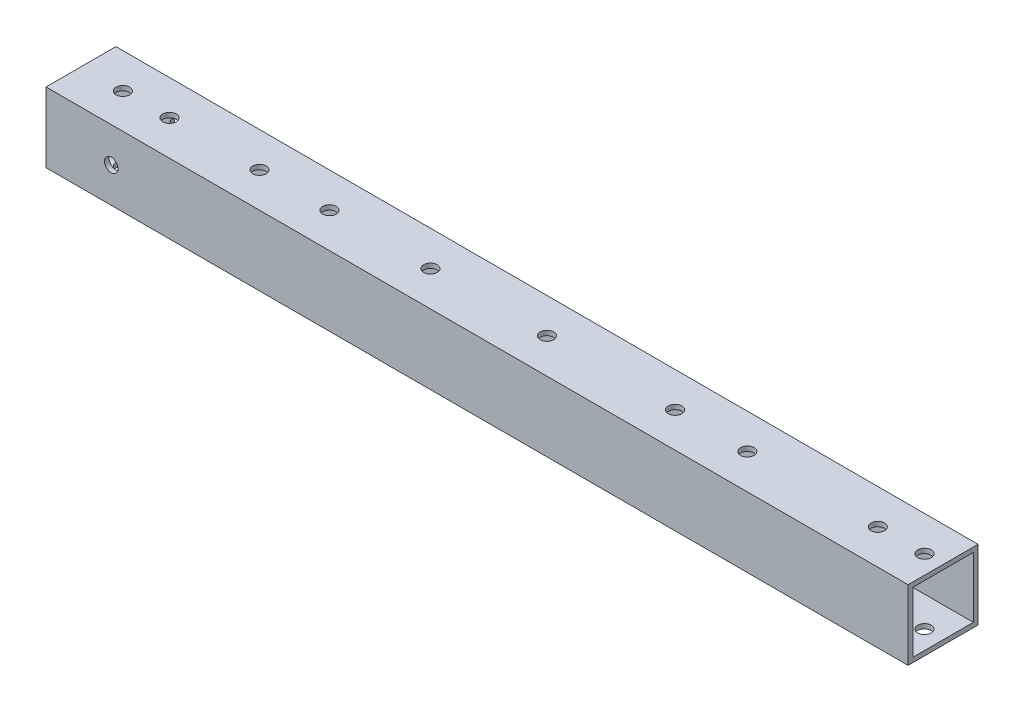
ISO-10303-21;
HEADER;
FILE_DESCRIPTION(('STEP AP214'),'2;1');
FILE_NAME('part.step','',(''),(''),'','','');
FILE_SCHEMA(('AUTOMOTIVE_DESIGN { 1 0 10303 214 1 1 1 1 }'));
ENDSEC;
DATA;
#1=APPLICATION_CONTEXT('core data for automotive mechanical design processes');
#2=APPLICATION_PROTOCOL_DEFINITION('international standard','automotive_design',2000,#1);
#3=PRODUCT_CONTEXT('',#1,'mechanical');
#4=PRODUCT('Part','Part','',(#3));
#5=PRODUCT_RELATED_PRODUCT_CATEGORY('part','',(#4));
#6=PRODUCT_DEFINITION_FORMATION('','',#4);
#7=PRODUCT_DEFINITION_CONTEXT('part definition',#1,'design');
#8=PRODUCT_DEFINITION('design','',#6,#7);
#9=PRODUCT_DEFINITION_SHAPE('','',#8);
#10=(LENGTH_UNIT() NAMED_UNIT(*) SI_UNIT(.MILLI.,.METRE.));
#11=(NAMED_UNIT(*) PLANE_ANGLE_UNIT() SI_UNIT($,.RADIAN.));
#12=(NAMED_UNIT(*) SI_UNIT($,.STERADIAN.) SOLID_ANGLE_UNIT());
#13=UNCERTAINTY_MEASURE_WITH_UNIT(LENGTH_MEASURE(1.E-05),#10,'distance_accuracy_value','');
#14=(GEOMETRIC_REPRESENTATION_CONTEXT(3) GLOBAL_UNCERTAINTY_ASSIGNED_CONTEXT((#13)) GLOBAL_UNIT_ASSIGNED_CONTEXT((#10,
#11,#12)) REPRESENTATION_CONTEXT('',''));
#15=CARTESIAN_POINT('',(0.,0.,0.));
#16=DIRECTION('',(0.,0.,1.));
#17=DIRECTION('',(1.,0.,0.));
#18=AXIS2_PLACEMENT_3D('',#15,#16,#17);
#19=CARTESIAN_POINT('',(185.,0.,0.));
#20=DIRECTION('',(-1.,0.,0.));
#21=DIRECTION('',(0.,0.,1.));
#22=AXIS2_PLACEMENT_3D('',#19,#20,#21);
#23=PLANE('',#22);
#24=DIRECTION('',(0.,1.,0.));
#25=VECTOR('',#24,1.);
#26=CARTESIAN_POINT('',(185.,-7.5,-7.5));
#27=LINE('',#26,#25);
#28=CARTESIAN_POINT('',(185.,-7.5,-7.5));
#29=VERTEX_POINT('',#28);
#30=CARTESIAN_POINT('',(185.,7.5,-7.5));
#31=VERTEX_POINT('',#30);
#32=EDGE_CURVE('E146',#29,#31,#27,.T.);
#33=ORIENTED_EDGE('',*,*,#32,.T.);
#34=DIRECTION('',(0.,0.,1.));
#35=VECTOR('',#34,1.);
#36=CARTESIAN_POINT('',(185.,7.5,7.5));
#37=LINE('',#36,#35);
#38=CARTESIAN_POINT('',(185.,7.5,7.5));
#39=VERTEX_POINT('',#38);
#40=EDGE_CURVE('E149',#31,#39,#37,.T.);
#41=ORIENTED_EDGE('',*,*,#40,.T.);
#42=DIRECTION('',(0.,-1.,0.));
#43=VECTOR('',#42,1.);
#44=CARTESIAN_POINT('',(185.,-7.5,7.5));
#45=LINE('',#44,#43);
#46=CARTESIAN_POINT('',(185.,-7.5,7.5));
#47=VERTEX_POINT('',#46);
#48=EDGE_CURVE('E152',#39,#47,#45,.T.);
#49=ORIENTED_EDGE('',*,*,#48,.T.);
#50=DIRECTION('',(0.,0.,-1.));
#51=VECTOR('',#50,1.);
#52=CARTESIAN_POINT('',(185.,-7.5,7.5));
#53=LINE('',#52,#51);
#54=EDGE_CURVE('E154',#47,#29,#53,.T.);
#55=ORIENTED_EDGE('',*,*,#54,.T.);
#56=EDGE_LOOP('',(#33,#41,#49,#55));
#57=FACE_BOUND('',#56,.T.);
#58=DIRECTION('',(0.,0.,-1.));
#59=VECTOR('',#58,1.);
#60=CARTESIAN_POINT('',(185.,-6.5,6.5));
#61=LINE('',#60,#59);
#62=CARTESIAN_POINT('',(185.,-6.5,6.5));
#63=VERTEX_POINT('',#62);
#64=CARTESIAN_POINT('',(185.,-6.5,-6.5));
#65=VERTEX_POINT('',#64);
#66=EDGE_CURVE('E108',#63,#65,#61,.T.);
#67=ORIENTED_EDGE('',*,*,#66,.F.);
#68=DIRECTION('',(0.,-1.,0.));
#69=VECTOR('',#68,1.);
#70=CARTESIAN_POINT('',(185.,-6.5,6.5));
#71=LINE('',#70,#69);
#72=CARTESIAN_POINT('',(185.,6.5,6.5));
#73=VERTEX_POINT('',#72);
#74=EDGE_CURVE('E130',#73,#63,#71,.T.);
#75=ORIENTED_EDGE('',*,*,#74,.F.);
#76=DIRECTION('',(0.,0.,1.));
#77=VECTOR('',#76,1.);
#78=CARTESIAN_POINT('',(185.,6.5,6.5));
#79=LINE('',#78,#77);
#80=CARTESIAN_POINT('',(185.,6.5,-6.5));
#81=VERTEX_POINT('',#80);
#82=EDGE_CURVE('E128',#81,#73,#79,.T.);
#83=ORIENTED_EDGE('',*,*,#82,.F.);
#84=DIRECTION('',(0.,1.,0.));
#85=VECTOR('',#84,1.);
#86=CARTESIAN_POINT('',(185.,-6.5,-6.5));
#87=LINE('',#86,#85);
#88=EDGE_CURVE('E116',#65,#81,#87,.T.);
#89=ORIENTED_EDGE('',*,*,#88,.F.);
#90=EDGE_LOOP('',(#67,#75,#83,#89));
#91=FACE_BOUND('',#90,.T.);
#92=ADVANCED_FACE('F41',(#57,#91),#23,.F.);
#93=CARTESIAN_POINT('',(0.,0.,0.));
#94=DIRECTION('',(-1.,0.,0.));
#95=DIRECTION('',(0.,0.,1.));
#96=AXIS2_PLACEMENT_3D('',#93,#94,#95);
#97=PLANE('',#96);
#98=DIRECTION('',(0.,1.,0.));
#99=VECTOR('',#98,1.);
#100=CARTESIAN_POINT('',(0.,-7.5,-7.5));
#101=LINE('',#100,#99);
#102=CARTESIAN_POINT('',(0.,-7.5,-7.5));
#103=VERTEX_POINT('',#102);
#104=CARTESIAN_POINT('',(0.,7.5,-7.5));
#105=VERTEX_POINT('',#104);
#106=EDGE_CURVE('E124',#103,#105,#101,.T.);
#107=ORIENTED_EDGE('',*,*,#106,.F.);
#108=DIRECTION('',(0.,0.,-1.));
#109=VECTOR('',#108,1.);
#110=CARTESIAN_POINT('',(0.,-7.5,7.5));
#111=LINE('',#110,#109);
#112=CARTESIAN_POINT('',(0.,-7.5,7.5));
#113=VERTEX_POINT('',#112);
#114=EDGE_CURVE('E150',#113,#103,#111,.T.);
#115=ORIENTED_EDGE('',*,*,#114,.F.);
#116=DIRECTION('',(0.,-1.,0.));
#117=VECTOR('',#116,1.);
#118=CARTESIAN_POINT('',(0.,-7.5,7.5));
#119=LINE('',#118,#117);
#120=CARTESIAN_POINT('',(0.,7.5,7.5));
#121=VERTEX_POINT('',#120);
#122=EDGE_CURVE('E161',#121,#113,#119,.T.);
#123=ORIENTED_EDGE('',*,*,#122,.F.);
#124=DIRECTION('',(0.,0.,1.));
#125=VECTOR('',#124,1.);
#126=CARTESIAN_POINT('',(0.,7.5,7.5));
#127=LINE('',#126,#125);
#128=EDGE_CURVE('E159',#105,#121,#127,.T.);
#129=ORIENTED_EDGE('',*,*,#128,.F.);
#130=EDGE_LOOP('',(#107,#115,#123,#129));
#131=FACE_BOUND('',#130,.T.);
#132=DIRECTION('',(0.,-1.,0.));
#133=VECTOR('',#132,1.);
#134=CARTESIAN_POINT('',(0.,-6.5,6.5));
#135=LINE('',#134,#133);
#136=CARTESIAN_POINT('',(0.,6.5,6.5));
#137=VERTEX_POINT('',#136);
#138=CARTESIAN_POINT('',(0.,-6.5,6.5));
#139=VERTEX_POINT('',#138);
#140=EDGE_CURVE('E117',#137,#139,#135,.T.);
#141=ORIENTED_EDGE('',*,*,#140,.T.);
#142=DIRECTION('',(0.,0.,-1.));
#143=VECTOR('',#142,1.);
#144=CARTESIAN_POINT('',(0.,-6.5,6.5));
#145=LINE('',#144,#143);
#146=CARTESIAN_POINT('',(0.,-6.5,-6.5));
#147=VERTEX_POINT('',#146);
#148=EDGE_CURVE('E66',#139,#147,#145,.T.);
#149=ORIENTED_EDGE('',*,*,#148,.T.);
#150=DIRECTION('',(0.,1.,0.));
#151=VECTOR('',#150,1.);
#152=CARTESIAN_POINT('',(0.,-6.5,-6.5));
#153=LINE('',#152,#151);
#154=CARTESIAN_POINT('',(0.,6.5,-6.5));
#155=VERTEX_POINT('',#154);
#156=EDGE_CURVE('E123',#147,#155,#153,.T.);
#157=ORIENTED_EDGE('',*,*,#156,.T.);
#158=DIRECTION('',(0.,0.,1.));
#159=VECTOR('',#158,1.);
#160=CARTESIAN_POINT('',(0.,6.5,6.5));
#161=LINE('',#160,#159);
#162=EDGE_CURVE('E138',#155,#137,#161,.T.);
#163=ORIENTED_EDGE('',*,*,#162,.T.);
#164=EDGE_LOOP('',(#141,#149,#157,#163));
#165=FACE_BOUND('',#164,.T.);
#166=ADVANCED_FACE('F315',(#131,#165),#97,.T.);
#167=CARTESIAN_POINT('',(185.,-7.5,-7.5));
#168=DIRECTION('',(0.,0.,1.));
#169=DIRECTION('',(1.,0.,0.));
#170=AXIS2_PLACEMENT_3D('',#167,#168,#169);
#171=PLANE('',#170);
#172=CARTESIAN_POINT('',(13.9999999999999,0.,-7.5));
#173=DIRECTION('',(0.,0.,1.));
#174=DIRECTION('',(1.,0.,0.));
#175=AXIS2_PLACEMENT_3D('',#172,#173,#174);
#176=CIRCLE('',#175,1.45);
#177=CARTESIAN_POINT('',(15.4499999999999,0.,-7.5));
#178=VERTEX_POINT('',#177);
#179=EDGE_CURVE('E298',#178,#178,#176,.T.);
#180=ORIENTED_EDGE('',*,*,#179,.T.);
#181=EDGE_LOOP('',(#180));
#182=FACE_BOUND('',#181,.T.);
#183=ORIENTED_EDGE('',*,*,#106,.T.);
#184=DIRECTION('',(-1.,0.,0.));
#185=VECTOR('',#184,1.);
#186=CARTESIAN_POINT('',(185.,7.5,-7.5));
#187=LINE('',#186,#185);
#188=EDGE_CURVE('E11',#31,#105,#187,.T.);
#189=ORIENTED_EDGE('',*,*,#188,.F.);
#190=ORIENTED_EDGE('',*,*,#32,.F.);
#191=DIRECTION('',(-1.,0.,0.));
#192=VECTOR('',#191,1.);
#193=CARTESIAN_POINT('',(185.,-7.5,-7.5));
#194=LINE('',#193,#192);
#195=EDGE_CURVE('E156',#29,#103,#194,.T.);
#196=ORIENTED_EDGE('',*,*,#195,.T.);
#197=EDGE_LOOP('',(#183,#189,#190,#196));
#198=FACE_BOUND('',#197,.T.);
#199=ADVANCED_FACE('F43',(#182,#198),#171,.F.);
#200=CARTESIAN_POINT('',(185.,7.5,7.5));
#201=DIRECTION('',(0.,-1.,0.));
#202=DIRECTION('',(0.,0.,-1.));
#203=AXIS2_PLACEMENT_3D('',#200,#201,#202);
#204=PLANE('',#203);
#205=CARTESIAN_POINT('',(181.,7.5,0.));
#206=DIRECTION('',(0.,-1.,0.));
#207=DIRECTION('',(0.,0.,-1.));
#208=AXIS2_PLACEMENT_3D('',#205,#206,#207);
#209=CIRCLE('',#208,1.45);
#210=CARTESIAN_POINT('',(181.,7.5,-1.45000000000004));
#211=VERTEX_POINT('',#210);
#212=EDGE_CURVE('E175',#211,#211,#209,.T.);
#213=ORIENTED_EDGE('',*,*,#212,.T.);
#214=EDGE_LOOP('',(#213));
#215=FACE_BOUND('',#214,.T.);
#216=CARTESIAN_POINT('',(53.3229490168753,7.5,0.));
#217=DIRECTION('',(0.,-1.,0.));
#218=DIRECTION('',(0.,0.,-1.));
#219=AXIS2_PLACEMENT_3D('',#216,#217,#218);
#220=CIRCLE('',#219,1.45);
#221=CARTESIAN_POINT('',(53.3229490168753,7.5,-1.45000000000002));
#222=VERTEX_POINT('',#221);
#223=EDGE_CURVE('E283',#222,#222,#220,.T.);
#224=ORIENTED_EDGE('',*,*,#223,.T.);
#225=EDGE_LOOP('',(#224));
#226=FACE_BOUND('',#225,.T.);
#227=CARTESIAN_POINT('',(171.,7.5,0.));
#228=DIRECTION('',(0.,-1.,0.));
#229=DIRECTION('',(0.,0.,-1.));
#230=AXIS2_PLACEMENT_3D('',#227,#228,#229);
#231=CIRCLE('',#230,1.44999999999997);
#232=CARTESIAN_POINT('',(171.,7.5,-1.45000000000001));
#233=VERTEX_POINT('',#232);
#234=EDGE_CURVE('E252',#233,#233,#231,.T.);
#235=ORIENTED_EDGE('',*,*,#234,.T.);
#236=EDGE_LOOP('',(#235));
#237=FACE_BOUND('',#236,.T.);
#238=CARTESIAN_POINT('',(127.5,7.5,0.));
#239=DIRECTION('',(0.,-1.,0.));
#240=DIRECTION('',(0.,0.,-1.));
#241=AXIS2_PLACEMENT_3D('',#238,#239,#240);
#242=CIRCLE('',#241,1.45);
#243=CARTESIAN_POINT('',(127.5,7.5,-1.45000000000001));
#244=VERTEX_POINT('',#243);
#245=EDGE_CURVE('E246',#244,#244,#242,.T.);
#246=ORIENTED_EDGE('',*,*,#245,.T.);
#247=EDGE_LOOP('',(#246));
#248=FACE_BOUND('',#247,.T.);
#249=CARTESIAN_POINT('',(99.9999999999999,7.5,0.));
#250=DIRECTION('',(0.,-1.,0.));
#251=DIRECTION('',(0.,0.,-1.));
#252=AXIS2_PLACEMENT_3D('',#249,#250,#251);
#253=CIRCLE('',#252,1.45);
#254=CARTESIAN_POINT('',(99.9999999999999,7.5,-1.45000000000001));
#255=VERTEX_POINT('',#254);
#256=EDGE_CURVE('E240',#255,#255,#253,.T.);
#257=ORIENTED_EDGE('',*,*,#256,.T.);
#258=EDGE_LOOP('',(#257));
#259=FACE_BOUND('',#258,.T.);
#260=CARTESIAN_POINT('',(74.9999999999999,7.5,0.));
#261=DIRECTION('',(0.,-1.,0.));
#262=DIRECTION('',(0.,0.,-1.));
#263=AXIS2_PLACEMENT_3D('',#260,#261,#262);
#264=CIRCLE('',#263,1.45);
#265=CARTESIAN_POINT('',(74.9999999999999,7.5,-1.45000000000001));
#266=VERTEX_POINT('',#265);
#267=EDGE_CURVE('E233',#266,#266,#264,.T.);
#268=ORIENTED_EDGE('',*,*,#267,.T.);
#269=EDGE_LOOP('',(#268));
#270=FACE_BOUND('',#269,.T.);
#271=CARTESIAN_POINT('',(18.9999999999999,7.5,0.));
#272=DIRECTION('',(0.,-1.,0.));
#273=DIRECTION('',(0.,0.,-1.));
#274=AXIS2_PLACEMENT_3D('',#271,#272,#273);
#275=CIRCLE('',#274,1.45);
#276=CARTESIAN_POINT('',(18.9999999999999,7.5,-1.45000000000007));
#277=VERTEX_POINT('',#276);
#278=EDGE_CURVE('E278',#277,#277,#275,.T.);
#279=ORIENTED_EDGE('',*,*,#278,.T.);
#280=EDGE_LOOP('',(#279));
#281=FACE_BOUND('',#280,.T.);
#282=CARTESIAN_POINT('',(8.99999999999991,7.5,0.));
#283=DIRECTION('',(0.,-1.,0.));
#284=DIRECTION('',(0.,0.,-1.));
#285=AXIS2_PLACEMENT_3D('',#282,#283,#284);
#286=CIRCLE('',#285,1.45);
#287=CARTESIAN_POINT('',(8.99999999999991,7.5,-1.45000000000007));
#288=VERTEX_POINT('',#287);
#289=EDGE_CURVE('E272',#288,#288,#286,.T.);
#290=ORIENTED_EDGE('',*,*,#289,.T.);
#291=EDGE_LOOP('',(#290));
#292=FACE_BOUND('',#291,.T.);
#293=CARTESIAN_POINT('',(143.,7.5,0.));
#294=DIRECTION('',(0.,-1.,0.));
#295=DIRECTION('',(0.,0.,-1.));
#296=AXIS2_PLACEMENT_3D('',#293,#294,#295);
#297=CIRCLE('',#296,1.45);
#298=CARTESIAN_POINT('',(143.,7.5,-1.45000000000001));
#299=VERTEX_POINT('',#298);
#300=EDGE_CURVE('E266',#299,#299,#297,.T.);
#301=ORIENTED_EDGE('',*,*,#300,.T.);
#302=EDGE_LOOP('',(#301));
#303=FACE_BOUND('',#302,.T.);
#304=CARTESIAN_POINT('',(38.3229490168753,7.5,0.));
#305=DIRECTION('',(0.,-1.,0.));
#306=DIRECTION('',(0.,0.,-1.));
#307=AXIS2_PLACEMENT_3D('',#304,#305,#306);
#308=CIRCLE('',#307,1.45);
#309=CARTESIAN_POINT('',(38.3229490168753,7.5,-1.45000000000003));
#310=VERTEX_POINT('',#309);
#311=EDGE_CURVE('E259',#310,#310,#308,.T.);
#312=ORIENTED_EDGE('',*,*,#311,.T.);
#313=EDGE_LOOP('',(#312));
#314=FACE_BOUND('',#313,.T.);
#315=ORIENTED_EDGE('',*,*,#128,.T.);
#316=DIRECTION('',(-1.,0.,0.));
#317=VECTOR('',#316,1.);
#318=CARTESIAN_POINT('',(185.,7.5,7.5));
#319=LINE('',#318,#317);
#320=EDGE_CURVE('E50',#39,#121,#319,.T.);
#321=ORIENTED_EDGE('',*,*,#320,.F.);
#322=ORIENTED_EDGE('',*,*,#40,.F.);
#323=ORIENTED_EDGE('',*,*,#188,.T.);
#324=EDGE_LOOP('',(#315,#321,#322,#323));
#325=FACE_BOUND('',#324,.T.);
#326=ADVANCED_FACE('F344',(#215,#226,#237,#248,#259,#270,#281,#292,#303,#314,#325),#204,.F.);
#327=CARTESIAN_POINT('',(185.,-7.5,7.5));
#328=DIRECTION('',(0.,0.,-1.));
#329=DIRECTION('',(-1.,0.,0.));
#330=AXIS2_PLACEMENT_3D('',#327,#328,#329);
#331=PLANE('',#330);
#332=CARTESIAN_POINT('',(13.9999999999999,0.,7.5));
#333=DIRECTION('',(0.,0.,1.));
#334=DIRECTION('',(1.,0.,0.));
#335=AXIS2_PLACEMENT_3D('',#332,#333,#334);
#336=CIRCLE('',#335,1.45);
#337=CARTESIAN_POINT('',(15.4499999999999,0.,7.5));
#338=VERTEX_POINT('',#337);
#339=EDGE_CURVE('E295',#338,#338,#336,.T.);
#340=ORIENTED_EDGE('',*,*,#339,.F.);
#341=EDGE_LOOP('',(#340));
#342=FACE_BOUND('',#341,.T.);
#343=ORIENTED_EDGE('',*,*,#122,.T.);
#344=DIRECTION('',(-1.,0.,0.));
#345=VECTOR('',#344,1.);
#346=CARTESIAN_POINT('',(185.,-7.5,7.5));
#347=LINE('',#346,#345);
#348=EDGE_CURVE('E166',#47,#113,#347,.T.);
#349=ORIENTED_EDGE('',*,*,#348,.F.);
#350=ORIENTED_EDGE('',*,*,#48,.F.);
#351=ORIENTED_EDGE('',*,*,#320,.T.);
#352=EDGE_LOOP('',(#343,#349,#350,#351));
#353=FACE_BOUND('',#352,.T.);
#354=ADVANCED_FACE('F341',(#342,#353),#331,.F.);
#355=CARTESIAN_POINT('',(185.,-7.5,7.5));
#356=DIRECTION('',(0.,1.,0.));
#357=DIRECTION('',(0.,0.,1.));
#358=AXIS2_PLACEMENT_3D('',#355,#356,#357);
#359=PLANE('',#358);
#360=CARTESIAN_POINT('',(181.,-7.5,0.));
#361=DIRECTION('',(0.,-1.,0.));
#362=DIRECTION('',(0.,0.,-1.));
#363=AXIS2_PLACEMENT_3D('',#360,#361,#362);
#364=CIRCLE('',#363,1.45);
#365=CARTESIAN_POINT('',(181.,-7.5,-1.45000000000004));
#366=VERTEX_POINT('',#365);
#367=EDGE_CURVE('E258',#366,#366,#364,.T.);
#368=ORIENTED_EDGE('',*,*,#367,.F.);
#369=EDGE_LOOP('',(#368));
#370=FACE_BOUND('',#369,.T.);
#371=CARTESIAN_POINT('',(53.3229490168753,-7.5,0.));
#372=DIRECTION('',(0.,-1.,0.));
#373=DIRECTION('',(0.,0.,-1.));
#374=AXIS2_PLACEMENT_3D('',#371,#372,#373);
#375=CIRCLE('',#374,1.45);
#376=CARTESIAN_POINT('',(53.3229490168753,-7.5,-1.45000000000002));
#377=VERTEX_POINT('',#376);
#378=EDGE_CURVE('E263',#377,#377,#375,.T.);
#379=ORIENTED_EDGE('',*,*,#378,.F.);
#380=EDGE_LOOP('',(#379));
#381=FACE_BOUND('',#380,.T.);
#382=CARTESIAN_POINT('',(171.,-7.5,0.));
#383=DIRECTION('',(0.,-1.,0.));
#384=DIRECTION('',(0.,0.,-1.));
#385=AXIS2_PLACEMENT_3D('',#382,#383,#384);
#386=CIRCLE('',#385,1.44999999999997);
#387=CARTESIAN_POINT('',(171.,-7.5,-1.45000000000001));
#388=VERTEX_POINT('',#387);
#389=EDGE_CURVE('E255',#388,#388,#386,.T.);
#390=ORIENTED_EDGE('',*,*,#389,.F.);
#391=EDGE_LOOP('',(#390));
#392=FACE_BOUND('',#391,.T.);
#393=CARTESIAN_POINT('',(127.5,-7.5,0.));
#394=DIRECTION('',(0.,-1.,0.));
#395=DIRECTION('',(0.,0.,-1.));
#396=AXIS2_PLACEMENT_3D('',#393,#394,#395);
#397=CIRCLE('',#396,1.45);
#398=CARTESIAN_POINT('',(127.5,-7.5,-1.45000000000001));
#399=VERTEX_POINT('',#398);
#400=EDGE_CURVE('E249',#399,#399,#397,.T.);
#401=ORIENTED_EDGE('',*,*,#400,.F.);
#402=EDGE_LOOP('',(#401));
#403=FACE_BOUND('',#402,.T.);
#404=CARTESIAN_POINT('',(99.9999999999999,-7.5,0.));
#405=DIRECTION('',(0.,-1.,0.));
#406=DIRECTION('',(0.,0.,-1.));
#407=AXIS2_PLACEMENT_3D('',#404,#405,#406);
#408=CIRCLE('',#407,1.45);
#409=CARTESIAN_POINT('',(99.9999999999999,-7.5,-1.45000000000001));
#410=VERTEX_POINT('',#409);
#411=EDGE_CURVE('E243',#410,#410,#408,.T.);
#412=ORIENTED_EDGE('',*,*,#411,.F.);
#413=EDGE_LOOP('',(#412));
#414=FACE_BOUND('',#413,.T.);
#415=CARTESIAN_POINT('',(74.9999999999999,-7.5,0.));
#416=DIRECTION('',(0.,-1.,0.));
#417=DIRECTION('',(0.,0.,-1.));
#418=AXIS2_PLACEMENT_3D('',#415,#416,#417);
#419=CIRCLE('',#418,1.45);
#420=CARTESIAN_POINT('',(74.9999999999999,-7.5,-1.45000000000001));
#421=VERTEX_POINT('',#420);
#422=EDGE_CURVE('E236',#421,#421,#419,.T.);
#423=ORIENTED_EDGE('',*,*,#422,.F.);
#424=EDGE_LOOP('',(#423));
#425=FACE_BOUND('',#424,.T.);
#426=CARTESIAN_POINT('',(18.9999999999999,-7.5,0.));
#427=DIRECTION('',(0.,-1.,0.));
#428=DIRECTION('',(0.,0.,-1.));
#429=AXIS2_PLACEMENT_3D('',#426,#427,#428);
#430=CIRCLE('',#429,1.45);
#431=CARTESIAN_POINT('',(18.9999999999999,-7.5,-1.45000000000007));
#432=VERTEX_POINT('',#431);
#433=EDGE_CURVE('E237',#432,#432,#430,.T.);
#434=ORIENTED_EDGE('',*,*,#433,.F.);
#435=EDGE_LOOP('',(#434));
#436=FACE_BOUND('',#435,.T.);
#437=CARTESIAN_POINT('',(8.99999999999991,-7.5,0.));
#438=DIRECTION('',(0.,-1.,0.));
#439=DIRECTION('',(0.,0.,-1.));
#440=AXIS2_PLACEMENT_3D('',#437,#438,#439);
#441=CIRCLE('',#440,1.45);
#442=CARTESIAN_POINT('',(8.99999999999991,-7.5,-1.45000000000007));
#443=VERTEX_POINT('',#442);
#444=EDGE_CURVE('E275',#443,#443,#441,.T.);
#445=ORIENTED_EDGE('',*,*,#444,.F.);
#446=EDGE_LOOP('',(#445));
#447=FACE_BOUND('',#446,.T.);
#448=CARTESIAN_POINT('',(143.,-7.5,0.));
#449=DIRECTION('',(0.,-1.,0.));
#450=DIRECTION('',(0.,0.,-1.));
#451=AXIS2_PLACEMENT_3D('',#448,#449,#450);
#452=CIRCLE('',#451,1.45);
#453=CARTESIAN_POINT('',(143.,-7.5,-1.45000000000001));
#454=VERTEX_POINT('',#453);
#455=EDGE_CURVE('E269',#454,#454,#452,.T.);
#456=ORIENTED_EDGE('',*,*,#455,.F.);
#457=EDGE_LOOP('',(#456));
#458=FACE_BOUND('',#457,.T.);
#459=CARTESIAN_POINT('',(38.3229490168753,-7.5,0.));
#460=DIRECTION('',(0.,-1.,0.));
#461=DIRECTION('',(0.,0.,-1.));
#462=AXIS2_PLACEMENT_3D('',#459,#460,#461);
#463=CIRCLE('',#462,1.45);
#464=CARTESIAN_POINT('',(38.3229490168753,-7.5,-1.45000000000003));
#465=VERTEX_POINT('',#464);
#466=EDGE_CURVE('E262',#465,#465,#463,.T.);
#467=ORIENTED_EDGE('',*,*,#466,.F.);
#468=EDGE_LOOP('',(#467));
#469=FACE_BOUND('',#468,.T.);
#470=ORIENTED_EDGE('',*,*,#114,.T.);
#471=ORIENTED_EDGE('',*,*,#195,.F.);
#472=ORIENTED_EDGE('',*,*,#54,.F.);
#473=ORIENTED_EDGE('',*,*,#348,.T.);
#474=EDGE_LOOP('',(#470,#471,#472,#473));
#475=FACE_BOUND('',#474,.T.);
#476=ADVANCED_FACE('F338',(#370,#381,#392,#403,#414,#425,#436,#447,#458,#469,#475),#359,.F.);
#477=CARTESIAN_POINT('',(185.,-6.5,6.5));
#478=DIRECTION('',(0.,1.,0.));
#479=DIRECTION('',(0.,0.,1.));
#480=AXIS2_PLACEMENT_3D('',#477,#478,#479);
#481=PLANE('',#480);
#482=CARTESIAN_POINT('',(181.,-6.5,0.));
#483=DIRECTION('',(0.,1.,0.));
#484=DIRECTION('',(0.,0.,1.));
#485=AXIS2_PLACEMENT_3D('',#482,#483,#484);
#486=CIRCLE('',#485,1.45);
#487=CARTESIAN_POINT('',(181.,-6.5,1.44999999999996));
#488=VERTEX_POINT('',#487);
#489=EDGE_CURVE('E136',#488,#488,#486,.T.);
#490=ORIENTED_EDGE('',*,*,#489,.F.);
#491=EDGE_LOOP('',(#490));
#492=FACE_BOUND('',#491,.T.);
#493=CARTESIAN_POINT('',(53.3229490168753,-6.5,0.));
#494=DIRECTION('',(0.,1.,0.));
#495=DIRECTION('',(0.,0.,1.));
#496=AXIS2_PLACEMENT_3D('',#493,#494,#495);
#497=CIRCLE('',#496,1.45);
#498=CARTESIAN_POINT('',(53.3229490168753,-6.5,1.44999999999998));
#499=VERTEX_POINT('',#498);
#500=EDGE_CURVE('E206',#499,#499,#497,.T.);
#501=ORIENTED_EDGE('',*,*,#500,.F.);
#502=EDGE_LOOP('',(#501));
#503=FACE_BOUND('',#502,.T.);
#504=CARTESIAN_POINT('',(171.,-6.5,0.));
#505=DIRECTION('',(0.,1.,0.));
#506=DIRECTION('',(0.,0.,1.));
#507=AXIS2_PLACEMENT_3D('',#504,#505,#506);
#508=CIRCLE('',#507,1.44999999999997);
#509=CARTESIAN_POINT('',(171.,-6.5,1.44999999999993));
#510=VERTEX_POINT('',#509);
#511=EDGE_CURVE('E203',#510,#510,#508,.T.);
#512=ORIENTED_EDGE('',*,*,#511,.F.);
#513=EDGE_LOOP('',(#512));
#514=FACE_BOUND('',#513,.T.);
#515=CARTESIAN_POINT('',(127.5,-6.5,0.));
#516=DIRECTION('',(0.,1.,0.));
#517=DIRECTION('',(0.,0.,1.));
#518=AXIS2_PLACEMENT_3D('',#515,#516,#517);
#519=CIRCLE('',#518,1.45);
#520=CARTESIAN_POINT('',(127.5,-6.5,1.44999999999999));
#521=VERTEX_POINT('',#520);
#522=EDGE_CURVE('E199',#521,#521,#519,.T.);
#523=ORIENTED_EDGE('',*,*,#522,.F.);
#524=EDGE_LOOP('',(#523));
#525=FACE_BOUND('',#524,.T.);
#526=CARTESIAN_POINT('',(99.9999999999999,-6.5,0.));
#527=DIRECTION('',(0.,1.,0.));
#528=DIRECTION('',(0.,0.,1.));
#529=AXIS2_PLACEMENT_3D('',#526,#527,#528);
#530=CIRCLE('',#529,1.45);
#531=CARTESIAN_POINT('',(99.9999999999999,-6.5,1.44999999999999));
#532=VERTEX_POINT('',#531);
#533=EDGE_CURVE('E195',#532,#532,#530,.T.);
#534=ORIENTED_EDGE('',*,*,#533,.F.);
#535=EDGE_LOOP('',(#534));
#536=FACE_BOUND('',#535,.T.);
#537=CARTESIAN_POINT('',(74.9999999999999,-6.5,0.));
#538=DIRECTION('',(0.,1.,0.));
#539=DIRECTION('',(0.,0.,1.));
#540=AXIS2_PLACEMENT_3D('',#537,#538,#539);
#541=CIRCLE('',#540,1.45);
#542=CARTESIAN_POINT('',(74.9999999999999,-6.5,1.44999999999999));
#543=VERTEX_POINT('',#542);
#544=EDGE_CURVE('E191',#543,#543,#541,.T.);
#545=ORIENTED_EDGE('',*,*,#544,.F.);
#546=EDGE_LOOP('',(#545));
#547=FACE_BOUND('',#546,.T.);
#548=CARTESIAN_POINT('',(18.9999999999999,-6.5,0.));
#549=DIRECTION('',(0.,1.,0.));
#550=DIRECTION('',(0.,0.,1.));
#551=AXIS2_PLACEMENT_3D('',#548,#549,#550);
#552=CIRCLE('',#551,1.45);
#553=CARTESIAN_POINT('',(18.9999999999999,-6.5,1.44999999999993));
#554=VERTEX_POINT('',#553);
#555=EDGE_CURVE('E187',#554,#554,#552,.T.);
#556=ORIENTED_EDGE('',*,*,#555,.F.);
#557=EDGE_LOOP('',(#556));
#558=FACE_BOUND('',#557,.T.);
#559=CARTESIAN_POINT('',(8.99999999999991,-6.5,0.));
#560=DIRECTION('',(0.,1.,0.));
#561=DIRECTION('',(0.,0.,1.));
#562=AXIS2_PLACEMENT_3D('',#559,#560,#561);
#563=CIRCLE('',#562,1.45);
#564=CARTESIAN_POINT('',(8.99999999999991,-6.5,1.44999999999993));
#565=VERTEX_POINT('',#564);
#566=EDGE_CURVE('E183',#565,#565,#563,.T.);
#567=ORIENTED_EDGE('',*,*,#566,.F.);
#568=EDGE_LOOP('',(#567));
#569=FACE_BOUND('',#568,.T.);
#570=CARTESIAN_POINT('',(143.,-6.5,0.));
#571=DIRECTION('',(0.,1.,0.));
#572=DIRECTION('',(0.,0.,1.));
#573=AXIS2_PLACEMENT_3D('',#570,#571,#572);
#574=CIRCLE('',#573,1.45);
#575=CARTESIAN_POINT('',(143.,-6.5,1.44999999999999));
#576=VERTEX_POINT('',#575);
#577=EDGE_CURVE('E179',#576,#576,#574,.T.);
#578=ORIENTED_EDGE('',*,*,#577,.F.);
#579=EDGE_LOOP('',(#578));
#580=FACE_BOUND('',#579,.T.);
#581=CARTESIAN_POINT('',(38.3229490168753,-6.5,0.));
#582=DIRECTION('',(0.,1.,0.));
#583=DIRECTION('',(0.,0.,1.));
#584=AXIS2_PLACEMENT_3D('',#581,#582,#583);
#585=CIRCLE('',#584,1.45);
#586=CARTESIAN_POINT('',(38.3229490168753,-6.5,1.44999999999997));
#587=VERTEX_POINT('',#586);
#588=EDGE_CURVE('E174',#587,#587,#585,.T.);
#589=ORIENTED_EDGE('',*,*,#588,.F.);
#590=EDGE_LOOP('',(#589));
#591=FACE_BOUND('',#590,.T.);
#592=ORIENTED_EDGE('',*,*,#148,.F.);
#593=DIRECTION('',(-1.,0.,0.));
#594=VECTOR('',#593,1.);
#595=CARTESIAN_POINT('',(185.,-6.5,6.5));
#596=LINE('',#595,#594);
#597=EDGE_CURVE('E112',#63,#139,#596,.T.);
#598=ORIENTED_EDGE('',*,*,#597,.F.);
#599=ORIENTED_EDGE('',*,*,#66,.T.);
#600=DIRECTION('',(-1.,0.,0.));
#601=VECTOR('',#600,1.);
#602=CARTESIAN_POINT('',(185.,-6.5,-6.5));
#603=LINE('',#602,#601);
#604=EDGE_CURVE('E111',#65,#147,#603,.T.);
#605=ORIENTED_EDGE('',*,*,#604,.T.);
#606=EDGE_LOOP('',(#592,#598,#599,#605));
#607=FACE_BOUND('',#606,.T.);
#608=ADVANCED_FACE('F110',(#492,#503,#514,#525,#536,#547,#558,#569,#580,#591,#607),#481,.T.);
#609=CARTESIAN_POINT('',(185.,-6.5,-6.5));
#610=DIRECTION('',(0.,0.,1.));
#611=DIRECTION('',(0.,-1.,0.));
#612=AXIS2_PLACEMENT_3D('',#609,#610,#611);
#613=PLANE('',#612);
#614=CARTESIAN_POINT('',(13.9999999999999,0.,-6.5));
#615=DIRECTION('',(0.,0.,1.));
#616=DIRECTION('',(0.,-1.,0.));
#617=AXIS2_PLACEMENT_3D('',#614,#615,#616);
#618=CIRCLE('',#617,1.45);
#619=CARTESIAN_POINT('',(13.9999999999999,-1.44999999999999,-6.5));
#620=VERTEX_POINT('',#619);
#621=EDGE_CURVE('E286',#620,#620,#618,.T.);
#622=ORIENTED_EDGE('',*,*,#621,.F.);
#623=EDGE_LOOP('',(#622));
#624=FACE_BOUND('',#623,.T.);
#625=ORIENTED_EDGE('',*,*,#156,.F.);
#626=ORIENTED_EDGE('',*,*,#604,.F.);
#627=ORIENTED_EDGE('',*,*,#88,.T.);
#628=DIRECTION('',(-1.,0.,0.));
#629=VECTOR('',#628,1.);
#630=CARTESIAN_POINT('',(185.,6.5,-6.5));
#631=LINE('',#630,#629);
#632=EDGE_CURVE('E125',#81,#155,#631,.T.);
#633=ORIENTED_EDGE('',*,*,#632,.T.);
#634=EDGE_LOOP('',(#625,#626,#627,#633));
#635=FACE_BOUND('',#634,.T.);
#636=ADVANCED_FACE('F120',(#624,#635),#613,.T.);
#637=CARTESIAN_POINT('',(185.,6.5,6.5));
#638=DIRECTION('',(0.,-1.,0.));
#639=DIRECTION('',(0.,0.,-1.));
#640=AXIS2_PLACEMENT_3D('',#637,#638,#639);
#641=PLANE('',#640);
#642=CARTESIAN_POINT('',(181.,6.5,0.));
#643=DIRECTION('',(0.,-1.,0.));
#644=DIRECTION('',(0.,0.,-1.));
#645=AXIS2_PLACEMENT_3D('',#642,#643,#644);
#646=CIRCLE('',#645,1.45);
#647=CARTESIAN_POINT('',(181.,6.5,-1.45000000000004));
#648=VERTEX_POINT('',#647);
#649=EDGE_CURVE('E207',#648,#648,#646,.T.);
#650=ORIENTED_EDGE('',*,*,#649,.F.);
#651=EDGE_LOOP('',(#650));
#652=FACE_BOUND('',#651,.T.);
#653=CARTESIAN_POINT('',(53.3229490168753,6.5,0.));
#654=DIRECTION('',(0.,-1.,0.));
#655=DIRECTION('',(0.,0.,-1.));
#656=AXIS2_PLACEMENT_3D('',#653,#654,#655);
#657=CIRCLE('',#656,1.45);
#658=CARTESIAN_POINT('',(53.3229490168753,6.5,-1.45000000000002));
#659=VERTEX_POINT('',#658);
#660=EDGE_CURVE('E204',#659,#659,#657,.T.);
#661=ORIENTED_EDGE('',*,*,#660,.F.);
#662=EDGE_LOOP('',(#661));
#663=FACE_BOUND('',#662,.T.);
#664=CARTESIAN_POINT('',(171.,6.5,0.));
#665=DIRECTION('',(0.,-1.,0.));
#666=DIRECTION('',(0.,0.,-1.));
#667=AXIS2_PLACEMENT_3D('',#664,#665,#666);
#668=CIRCLE('',#667,1.44999999999997);
#669=CARTESIAN_POINT('',(171.,6.5,-1.45000000000001));
#670=VERTEX_POINT('',#669);
#671=EDGE_CURVE('E200',#670,#670,#668,.T.);
#672=ORIENTED_EDGE('',*,*,#671,.F.);
#673=EDGE_LOOP('',(#672));
#674=FACE_BOUND('',#673,.T.);
#675=CARTESIAN_POINT('',(127.5,6.5,0.));
#676=DIRECTION('',(0.,-1.,0.));
#677=DIRECTION('',(0.,0.,-1.));
#678=AXIS2_PLACEMENT_3D('',#675,#676,#677);
#679=CIRCLE('',#678,1.45);
#680=CARTESIAN_POINT('',(127.5,6.5,-1.45000000000001));
#681=VERTEX_POINT('',#680);
#682=EDGE_CURVE('E196',#681,#681,#679,.T.);
#683=ORIENTED_EDGE('',*,*,#682,.F.);
#684=EDGE_LOOP('',(#683));
#685=FACE_BOUND('',#684,.T.);
#686=CARTESIAN_POINT('',(99.9999999999999,6.5,0.));
#687=DIRECTION('',(0.,-1.,0.));
#688=DIRECTION('',(0.,0.,-1.));
#689=AXIS2_PLACEMENT_3D('',#686,#687,#688);
#690=CIRCLE('',#689,1.45);
#691=CARTESIAN_POINT('',(99.9999999999999,6.5,-1.45000000000001));
#692=VERTEX_POINT('',#691);
#693=EDGE_CURVE('E192',#692,#692,#690,.T.);
#694=ORIENTED_EDGE('',*,*,#693,.F.);
#695=EDGE_LOOP('',(#694));
#696=FACE_BOUND('',#695,.T.);
#697=CARTESIAN_POINT('',(74.9999999999999,6.5,0.));
#698=DIRECTION('',(0.,-1.,0.));
#699=DIRECTION('',(0.,0.,-1.));
#700=AXIS2_PLACEMENT_3D('',#697,#698,#699);
#701=CIRCLE('',#700,1.45);
#702=CARTESIAN_POINT('',(74.9999999999999,6.5,-1.45000000000001));
#703=VERTEX_POINT('',#702);
#704=EDGE_CURVE('E188',#703,#703,#701,.T.);
#705=ORIENTED_EDGE('',*,*,#704,.F.);
#706=EDGE_LOOP('',(#705));
#707=FACE_BOUND('',#706,.T.);
#708=CARTESIAN_POINT('',(18.9999999999999,6.5,0.));
#709=DIRECTION('',(0.,-1.,0.));
#710=DIRECTION('',(0.,0.,-1.));
#711=AXIS2_PLACEMENT_3D('',#708,#709,#710);
#712=CIRCLE('',#711,1.45);
#713=CARTESIAN_POINT('',(18.9999999999999,6.5,-1.45000000000007));
#714=VERTEX_POINT('',#713);
#715=EDGE_CURVE('E184',#714,#714,#712,.T.);
#716=ORIENTED_EDGE('',*,*,#715,.F.);
#717=EDGE_LOOP('',(#716));
#718=FACE_BOUND('',#717,.T.);
#719=CARTESIAN_POINT('',(8.99999999999991,6.5,0.));
#720=DIRECTION('',(0.,-1.,0.));
#721=DIRECTION('',(0.,0.,-1.));
#722=AXIS2_PLACEMENT_3D('',#719,#720,#721);
#723=CIRCLE('',#722,1.45);
#724=CARTESIAN_POINT('',(8.99999999999991,6.5,-1.45000000000007));
#725=VERTEX_POINT('',#724);
#726=EDGE_CURVE('E180',#725,#725,#723,.T.);
#727=ORIENTED_EDGE('',*,*,#726,.F.);
#728=EDGE_LOOP('',(#727));
#729=FACE_BOUND('',#728,.T.);
#730=CARTESIAN_POINT('',(143.,6.5,0.));
#731=DIRECTION('',(0.,-1.,0.));
#732=DIRECTION('',(0.,0.,-1.));
#733=AXIS2_PLACEMENT_3D('',#730,#731,#732);
#734=CIRCLE('',#733,1.45);
#735=CARTESIAN_POINT('',(143.,6.5,-1.45000000000001));
#736=VERTEX_POINT('',#735);
#737=EDGE_CURVE('E176',#736,#736,#734,.T.);
#738=ORIENTED_EDGE('',*,*,#737,.F.);
#739=EDGE_LOOP('',(#738));
#740=FACE_BOUND('',#739,.T.);
#741=CARTESIAN_POINT('',(38.3229490168753,6.5,0.));
#742=DIRECTION('',(0.,-1.,0.));
#743=DIRECTION('',(0.,0.,-1.));
#744=AXIS2_PLACEMENT_3D('',#741,#742,#743);
#745=CIRCLE('',#744,1.45);
#746=CARTESIAN_POINT('',(38.3229490168753,6.5,-1.45000000000003));
#747=VERTEX_POINT('',#746);
#748=EDGE_CURVE('E171',#747,#747,#745,.T.);
#749=ORIENTED_EDGE('',*,*,#748,.F.);
#750=EDGE_LOOP('',(#749));
#751=FACE_BOUND('',#750,.T.);
#752=ORIENTED_EDGE('',*,*,#162,.F.);
#753=ORIENTED_EDGE('',*,*,#632,.F.);
#754=ORIENTED_EDGE('',*,*,#82,.T.);
#755=DIRECTION('',(-1.,0.,0.));
#756=VECTOR('',#755,1.);
#757=CARTESIAN_POINT('',(185.,6.5,6.5));
#758=LINE('',#757,#756);
#759=EDGE_CURVE('E58',#73,#137,#758,.T.);
#760=ORIENTED_EDGE('',*,*,#759,.T.);
#761=EDGE_LOOP('',(#752,#753,#754,#760));
#762=FACE_BOUND('',#761,.T.);
#763=ADVANCED_FACE('F311',(#652,#663,#674,#685,#696,#707,#718,#729,#740,#751,#762),#641,.T.);
#764=CARTESIAN_POINT('',(185.,-6.5,6.5));
#765=DIRECTION('',(0.,0.,-1.));
#766=DIRECTION('',(-1.,0.,0.));
#767=AXIS2_PLACEMENT_3D('',#764,#765,#766);
#768=PLANE('',#767);
#769=CARTESIAN_POINT('',(13.9999999999999,0.,6.5));
#770=DIRECTION('',(0.,0.,-1.));
#771=DIRECTION('',(-1.,0.,0.));
#772=AXIS2_PLACEMENT_3D('',#769,#770,#771);
#773=CIRCLE('',#772,1.45);
#774=CARTESIAN_POINT('',(12.5499999999999,0.,6.5));
#775=VERTEX_POINT('',#774);
#776=EDGE_CURVE('E45',#775,#775,#773,.T.);
#777=ORIENTED_EDGE('',*,*,#776,.F.);
#778=EDGE_LOOP('',(#777));
#779=FACE_BOUND('',#778,.T.);
#780=ORIENTED_EDGE('',*,*,#140,.F.);
#781=ORIENTED_EDGE('',*,*,#759,.F.);
#782=ORIENTED_EDGE('',*,*,#74,.T.);
#783=ORIENTED_EDGE('',*,*,#597,.T.);
#784=EDGE_LOOP('',(#780,#781,#782,#783));
#785=FACE_BOUND('',#784,.T.);
#786=ADVANCED_FACE('F308',(#779,#785),#768,.T.);
#787=CARTESIAN_POINT('',(38.3229490168753,7.5,0.));
#788=DIRECTION('',(0.,-1.,0.));
#789=DIRECTION('',(0.,0.,-1.));
#790=AXIS2_PLACEMENT_3D('',#787,#788,#789);
#791=CYLINDRICAL_SURFACE('',#790,1.45);
#792=ORIENTED_EDGE('',*,*,#748,.T.);
#793=EDGE_LOOP('',(#792));
#794=FACE_BOUND('',#793,.T.);
#795=ORIENTED_EDGE('',*,*,#311,.F.);
#796=EDGE_LOOP('',(#795));
#797=FACE_BOUND('',#796,.T.);
#798=ADVANCED_FACE('F310',(#794,#797),#791,.F.);
#799=CARTESIAN_POINT('',(143.,7.5,0.));
#800=DIRECTION('',(0.,-1.,0.));
#801=DIRECTION('',(0.,0.,-1.));
#802=AXIS2_PLACEMENT_3D('',#799,#800,#801);
#803=CYLINDRICAL_SURFACE('',#802,1.45);
#804=ORIENTED_EDGE('',*,*,#737,.T.);
#805=EDGE_LOOP('',(#804));
#806=FACE_BOUND('',#805,.T.);
#807=ORIENTED_EDGE('',*,*,#300,.F.);
#808=EDGE_LOOP('',(#807));
#809=FACE_BOUND('',#808,.T.);
#810=ADVANCED_FACE('F385',(#806,#809),#803,.F.);
#811=CARTESIAN_POINT('',(8.99999999999991,7.5,0.));
#812=DIRECTION('',(0.,-1.,0.));
#813=DIRECTION('',(0.,0.,-1.));
#814=AXIS2_PLACEMENT_3D('',#811,#812,#813);
#815=CYLINDRICAL_SURFACE('',#814,1.45);
#816=ORIENTED_EDGE('',*,*,#726,.T.);
#817=EDGE_LOOP('',(#816));
#818=FACE_BOUND('',#817,.T.);
#819=ORIENTED_EDGE('',*,*,#289,.F.);
#820=EDGE_LOOP('',(#819));
#821=FACE_BOUND('',#820,.T.);
#822=ADVANCED_FACE('F392',(#818,#821),#815,.F.);
#823=CARTESIAN_POINT('',(18.9999999999999,7.5,0.));
#824=DIRECTION('',(0.,-1.,0.));
#825=DIRECTION('',(0.,0.,-1.));
#826=AXIS2_PLACEMENT_3D('',#823,#824,#825);
#827=CYLINDRICAL_SURFACE('',#826,1.45);
#828=ORIENTED_EDGE('',*,*,#715,.T.);
#829=EDGE_LOOP('',(#828));
#830=FACE_BOUND('',#829,.T.);
#831=ORIENTED_EDGE('',*,*,#278,.F.);
#832=EDGE_LOOP('',(#831));
#833=FACE_BOUND('',#832,.T.);
#834=ADVANCED_FACE('F449',(#830,#833),#827,.F.);
#835=CARTESIAN_POINT('',(74.9999999999999,7.5,0.));
#836=DIRECTION('',(0.,-1.,0.));
#837=DIRECTION('',(0.,0.,-1.));
#838=AXIS2_PLACEMENT_3D('',#835,#836,#837);
#839=CYLINDRICAL_SURFACE('',#838,1.45);
#840=ORIENTED_EDGE('',*,*,#704,.T.);
#841=EDGE_LOOP('',(#840));
#842=FACE_BOUND('',#841,.T.);
#843=ORIENTED_EDGE('',*,*,#267,.F.);
#844=EDGE_LOOP('',(#843));
#845=FACE_BOUND('',#844,.T.);
#846=ADVANCED_FACE('F455',(#842,#845),#839,.F.);
#847=CARTESIAN_POINT('',(99.9999999999999,7.5,0.));
#848=DIRECTION('',(0.,-1.,0.));
#849=DIRECTION('',(0.,0.,-1.));
#850=AXIS2_PLACEMENT_3D('',#847,#848,#849);
#851=CYLINDRICAL_SURFACE('',#850,1.45);
#852=ORIENTED_EDGE('',*,*,#693,.T.);
#853=EDGE_LOOP('',(#852));
#854=FACE_BOUND('',#853,.T.);
#855=ORIENTED_EDGE('',*,*,#256,.F.);
#856=EDGE_LOOP('',(#855));
#857=FACE_BOUND('',#856,.T.);
#858=ADVANCED_FACE('F468',(#854,#857),#851,.F.);
#859=CARTESIAN_POINT('',(127.5,7.5,0.));
#860=DIRECTION('',(0.,-1.,0.));
#861=DIRECTION('',(0.,0.,-1.));
#862=AXIS2_PLACEMENT_3D('',#859,#860,#861);
#863=CYLINDRICAL_SURFACE('',#862,1.45);
#864=ORIENTED_EDGE('',*,*,#682,.T.);
#865=EDGE_LOOP('',(#864));
#866=FACE_BOUND('',#865,.T.);
#867=ORIENTED_EDGE('',*,*,#245,.F.);
#868=EDGE_LOOP('',(#867));
#869=FACE_BOUND('',#868,.T.);
#870=ADVANCED_FACE('F517',(#866,#869),#863,.F.);
#871=CARTESIAN_POINT('',(171.,7.5,0.));
#872=DIRECTION('',(0.,-1.,0.));
#873=DIRECTION('',(0.,0.,-1.));
#874=AXIS2_PLACEMENT_3D('',#871,#872,#873);
#875=CYLINDRICAL_SURFACE('',#874,1.44999999999997);
#876=ORIENTED_EDGE('',*,*,#671,.T.);
#877=EDGE_LOOP('',(#876));
#878=FACE_BOUND('',#877,.T.);
#879=ORIENTED_EDGE('',*,*,#234,.F.);
#880=EDGE_LOOP('',(#879));
#881=FACE_BOUND('',#880,.T.);
#882=ADVANCED_FACE('F474',(#878,#881),#875,.F.);
#883=CARTESIAN_POINT('',(53.3229490168753,7.5,0.));
#884=DIRECTION('',(0.,-1.,0.));
#885=DIRECTION('',(0.,0.,-1.));
#886=AXIS2_PLACEMENT_3D('',#883,#884,#885);
#887=CYLINDRICAL_SURFACE('',#886,1.45);
#888=ORIENTED_EDGE('',*,*,#660,.T.);
#889=EDGE_LOOP('',(#888));
#890=FACE_BOUND('',#889,.T.);
#891=ORIENTED_EDGE('',*,*,#223,.F.);
#892=EDGE_LOOP('',(#891));
#893=FACE_BOUND('',#892,.T.);
#894=ADVANCED_FACE('F406',(#890,#893),#887,.F.);
#895=CARTESIAN_POINT('',(181.,7.5,0.));
#896=DIRECTION('',(0.,-1.,0.));
#897=DIRECTION('',(0.,0.,-1.));
#898=AXIS2_PLACEMENT_3D('',#895,#896,#897);
#899=CYLINDRICAL_SURFACE('',#898,1.45);
#900=ORIENTED_EDGE('',*,*,#649,.T.);
#901=EDGE_LOOP('',(#900));
#902=FACE_BOUND('',#901,.T.);
#903=ORIENTED_EDGE('',*,*,#212,.F.);
#904=EDGE_LOOP('',(#903));
#905=FACE_BOUND('',#904,.T.);
#906=ADVANCED_FACE('F398',(#902,#905),#899,.F.);
#907=ORIENTED_EDGE('',*,*,#588,.T.);
#908=EDGE_LOOP('',(#907));
#909=FACE_BOUND('',#908,.T.);
#910=ORIENTED_EDGE('',*,*,#466,.T.);
#911=EDGE_LOOP('',(#910));
#912=FACE_BOUND('',#911,.T.);
#913=ADVANCED_FACE('F388',(#909,#912),#791,.F.);
#914=ORIENTED_EDGE('',*,*,#577,.T.);
#915=EDGE_LOOP('',(#914));
#916=FACE_BOUND('',#915,.T.);
#917=ORIENTED_EDGE('',*,*,#455,.T.);
#918=EDGE_LOOP('',(#917));
#919=FACE_BOUND('',#918,.T.);
#920=ADVANCED_FACE('F395',(#916,#919),#803,.F.);
#921=ORIENTED_EDGE('',*,*,#566,.T.);
#922=EDGE_LOOP('',(#921));
#923=FACE_BOUND('',#922,.T.);
#924=ORIENTED_EDGE('',*,*,#444,.T.);
#925=EDGE_LOOP('',(#924));
#926=FACE_BOUND('',#925,.T.);
#927=ADVANCED_FACE('F404',(#923,#926),#815,.F.);
#928=ORIENTED_EDGE('',*,*,#555,.T.);
#929=EDGE_LOOP('',(#928));
#930=FACE_BOUND('',#929,.T.);
#931=ORIENTED_EDGE('',*,*,#433,.T.);
#932=EDGE_LOOP('',(#931));
#933=FACE_BOUND('',#932,.T.);
#934=ADVANCED_FACE('F439',(#930,#933),#827,.F.);
#935=ORIENTED_EDGE('',*,*,#544,.T.);
#936=EDGE_LOOP('',(#935));
#937=FACE_BOUND('',#936,.T.);
#938=ORIENTED_EDGE('',*,*,#422,.T.);
#939=EDGE_LOOP('',(#938));
#940=FACE_BOUND('',#939,.T.);
#941=ADVANCED_FACE('F446',(#937,#940),#839,.F.);
#942=ORIENTED_EDGE('',*,*,#533,.T.);
#943=EDGE_LOOP('',(#942));
#944=FACE_BOUND('',#943,.T.);
#945=ORIENTED_EDGE('',*,*,#411,.T.);
#946=EDGE_LOOP('',(#945));
#947=FACE_BOUND('',#946,.T.);
#948=ADVANCED_FACE('F507',(#944,#947),#851,.F.);
#949=ORIENTED_EDGE('',*,*,#522,.T.);
#950=EDGE_LOOP('',(#949));
#951=FACE_BOUND('',#950,.T.);
#952=ORIENTED_EDGE('',*,*,#400,.T.);
#953=EDGE_LOOP('',(#952));
#954=FACE_BOUND('',#953,.T.);
#955=ADVANCED_FACE('F512',(#951,#954),#863,.F.);
#956=ORIENTED_EDGE('',*,*,#511,.T.);
#957=EDGE_LOOP('',(#956));
#958=FACE_BOUND('',#957,.T.);
#959=ORIENTED_EDGE('',*,*,#389,.T.);
#960=EDGE_LOOP('',(#959));
#961=FACE_BOUND('',#960,.T.);
#962=ADVANCED_FACE('F489',(#958,#961),#875,.F.);
#963=ORIENTED_EDGE('',*,*,#500,.T.);
#964=EDGE_LOOP('',(#963));
#965=FACE_BOUND('',#964,.T.);
#966=ORIENTED_EDGE('',*,*,#378,.T.);
#967=EDGE_LOOP('',(#966));
#968=FACE_BOUND('',#967,.T.);
#969=ADVANCED_FACE('F476',(#965,#968),#887,.F.);
#970=ORIENTED_EDGE('',*,*,#489,.T.);
#971=EDGE_LOOP('',(#970));
#972=FACE_BOUND('',#971,.T.);
#973=ORIENTED_EDGE('',*,*,#367,.T.);
#974=EDGE_LOOP('',(#973));
#975=FACE_BOUND('',#974,.T.);
#976=ADVANCED_FACE('F408',(#972,#975),#899,.F.);
#977=CARTESIAN_POINT('',(13.9999999999999,0.,-7.5));
#978=DIRECTION('',(0.,0.,1.));
#979=DIRECTION('',(1.,0.,0.));
#980=AXIS2_PLACEMENT_3D('',#977,#978,#979);
#981=CYLINDRICAL_SURFACE('',#980,1.45);
#982=ORIENTED_EDGE('',*,*,#776,.T.);
#983=EDGE_LOOP('',(#982));
#984=FACE_BOUND('',#983,.T.);
#985=ORIENTED_EDGE('',*,*,#339,.T.);
#986=EDGE_LOOP('',(#985));
#987=FACE_BOUND('',#986,.T.);
#988=ADVANCED_FACE('F305',(#984,#987),#981,.F.);
#989=ORIENTED_EDGE('',*,*,#621,.T.);
#990=EDGE_LOOP('',(#989));
#991=FACE_BOUND('',#990,.T.);
#992=ORIENTED_EDGE('',*,*,#179,.F.);
#993=EDGE_LOOP('',(#992));
#994=FACE_BOUND('',#993,.T.);
#995=ADVANCED_FACE('F479',(#991,#994),#981,.F.);
#996=CLOSED_SHELL('',(#92,#166,#199,#326,#354,#476,#608,#636,#763,#786,#798,#810,#822,#834,#846,
#858,#870,#882,#894,#906,#913,#920,#927,#934,#941,#948,#955,#962,#969,#976,#988,#995));
#997=MANIFOLD_SOLID_BREP('B2',#996);
#998=ADVANCED_BREP_SHAPE_REPRESENTATION('',(#18,#997),#14);
#999=SHAPE_DEFINITION_REPRESENTATION(#9,#998);
ENDSEC;
END-ISO-10303-21;
